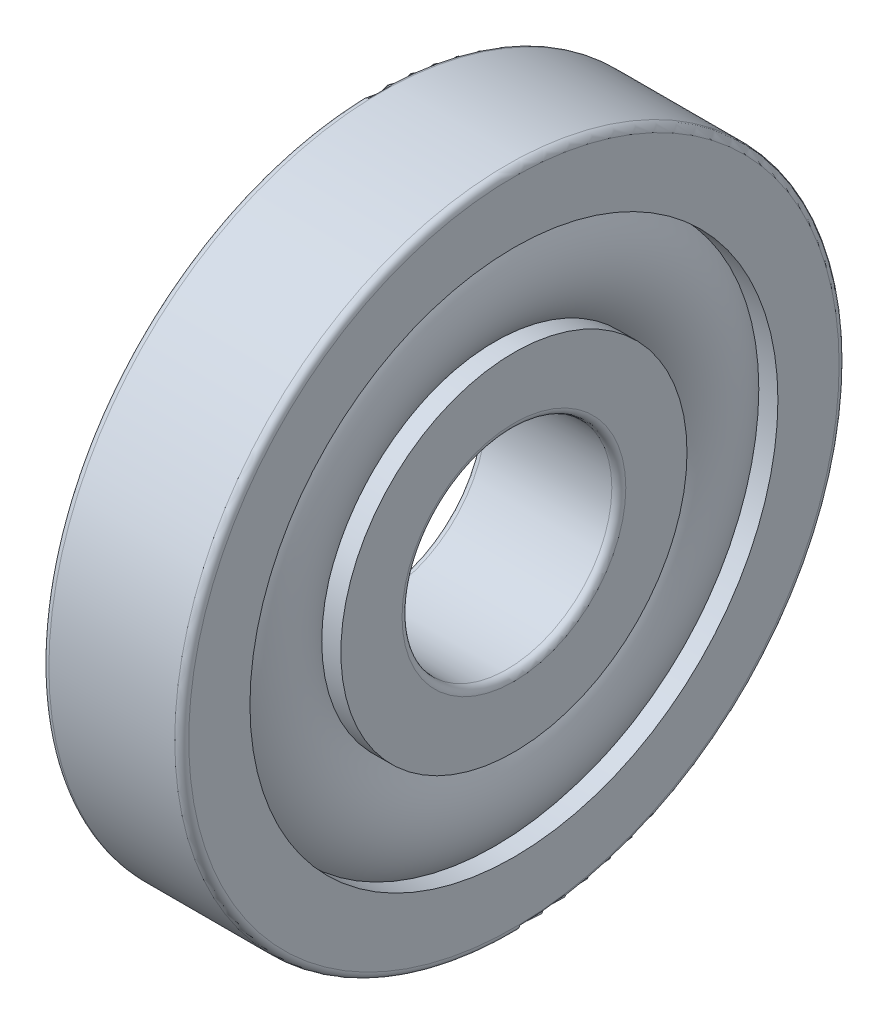
ISO-10303-21;
HEADER;
FILE_DESCRIPTION(('STEP AP214'),'2;1');
FILE_NAME('part.step','',(''),(''),'','','');
FILE_SCHEMA(('AUTOMOTIVE_DESIGN { 1 0 10303 214 1 1 1 1 }'));
ENDSEC;
DATA;
#1=APPLICATION_CONTEXT('core data for automotive mechanical design processes');
#2=APPLICATION_PROTOCOL_DEFINITION('international standard','automotive_design',2000,#1);
#3=PRODUCT_CONTEXT('',#1,'mechanical');
#4=PRODUCT('Part','Part','',(#3));
#5=PRODUCT_RELATED_PRODUCT_CATEGORY('part','',(#4));
#6=PRODUCT_DEFINITION_FORMATION('','',#4);
#7=PRODUCT_DEFINITION_CONTEXT('part definition',#1,'design');
#8=PRODUCT_DEFINITION('design','',#6,#7);
#9=PRODUCT_DEFINITION_SHAPE('','',#8);
#10=(LENGTH_UNIT() NAMED_UNIT(*) SI_UNIT(.MILLI.,.METRE.));
#11=(NAMED_UNIT(*) PLANE_ANGLE_UNIT() SI_UNIT($,.RADIAN.));
#12=(NAMED_UNIT(*) SI_UNIT($,.STERADIAN.) SOLID_ANGLE_UNIT());
#13=UNCERTAINTY_MEASURE_WITH_UNIT(LENGTH_MEASURE(1.E-05),#10,'distance_accuracy_value','');
#14=(GEOMETRIC_REPRESENTATION_CONTEXT(3) GLOBAL_UNCERTAINTY_ASSIGNED_CONTEXT((#13)) GLOBAL_UNIT_ASSIGNED_CONTEXT((#10,
#11,#12)) REPRESENTATION_CONTEXT('',''));
#15=CARTESIAN_POINT('',(0.,0.,0.));
#16=DIRECTION('',(0.,0.,1.));
#17=DIRECTION('',(1.,0.,0.));
#18=AXIS2_PLACEMENT_3D('',#15,#16,#17);
#19=CARTESIAN_POINT('',(0.,0.,0.));
#20=DIRECTION('',(-1.,0.,0.));
#21=DIRECTION('',(0.,0.,1.));
#22=AXIS2_PLACEMENT_3D('',#19,#20,#21);
#23=TOROIDAL_SURFACE('',#22,6.25,1.95);
#24=CARTESIAN_POINT('',(1.45344418537486,0.,0.));
#25=DIRECTION('',(-1.,0.,0.));
#26=DIRECTION('',(0.,0.,1.));
#27=AXIS2_PLACEMENT_3D('',#24,#25,#26);
#28=CIRCLE('',#27,7.55);
#29=CARTESIAN_POINT('',(1.45344418537486,0.,7.55));
#30=VERTEX_POINT('',#29);
#31=EDGE_CURVE('E36',#30,#30,#28,.F.);
#32=ORIENTED_EDGE('',*,*,#31,.T.);
#33=EDGE_LOOP('',(#32));
#34=FACE_BOUND('',#33,.T.);
#35=CARTESIAN_POINT('',(1.45344418537486,0.,0.));
#36=DIRECTION('',(-1.,0.,0.));
#37=DIRECTION('',(0.,0.,1.));
#38=AXIS2_PLACEMENT_3D('',#35,#36,#37);
#39=CIRCLE('',#38,4.95);
#40=CARTESIAN_POINT('',(1.45344418537486,0.,4.95));
#41=VERTEX_POINT('',#40);
#42=EDGE_CURVE('E10',#41,#41,#39,.T.);
#43=ORIENTED_EDGE('',*,*,#42,.T.);
#44=EDGE_LOOP('',(#43));
#45=FACE_BOUND('',#44,.T.);
#46=ADVANCED_FACE('F32',(#34,#45),#23,.T.);
#47=CARTESIAN_POINT('',(-20.6375,0.,0.));
#48=DIRECTION('',(1.,0.,0.));
#49=DIRECTION('',(0.,0.,-1.));
#50=AXIS2_PLACEMENT_3D('',#47,#48,#49);
#51=CYLINDRICAL_SURFACE('',#50,4.95);
#52=CARTESIAN_POINT('',(2.,0.,0.));
#53=DIRECTION('',(1.,0.,0.));
#54=DIRECTION('',(0.,0.,-1.));
#55=AXIS2_PLACEMENT_3D('',#52,#53,#54);
#56=CIRCLE('',#55,4.95);
#57=CARTESIAN_POINT('',(2.,0.,-4.95));
#58=VERTEX_POINT('',#57);
#59=EDGE_CURVE('E45',#58,#58,#56,.T.);
#60=ORIENTED_EDGE('',*,*,#59,.F.);
#61=EDGE_LOOP('',(#60));
#62=FACE_BOUND('',#61,.T.);
#63=ORIENTED_EDGE('',*,*,#42,.F.);
#64=EDGE_LOOP('',(#63));
#65=FACE_BOUND('',#64,.T.);
#66=ADVANCED_FACE('F84',(#62,#65),#51,.T.);
#67=CARTESIAN_POINT('',(-20.6375,0.,0.));
#68=DIRECTION('',(1.,0.,0.));
#69=DIRECTION('',(0.,0.,-1.));
#70=AXIS2_PLACEMENT_3D('',#67,#68,#69);
#71=CYLINDRICAL_SURFACE('',#70,4.95);
#72=CARTESIAN_POINT('',(-2.,0.,0.));
#73=DIRECTION('',(1.,0.,0.));
#74=DIRECTION('',(0.,0.,-1.));
#75=AXIS2_PLACEMENT_3D('',#72,#73,#74);
#76=CIRCLE('',#75,4.95);
#77=CARTESIAN_POINT('',(-2.,0.,-4.95));
#78=VERTEX_POINT('',#77);
#79=EDGE_CURVE('E54',#78,#78,#76,.T.);
#80=ORIENTED_EDGE('',*,*,#79,.T.);
#81=EDGE_LOOP('',(#80));
#82=FACE_BOUND('',#81,.T.);
#83=CARTESIAN_POINT('',(-1.45344418537486,0.,0.));
#84=DIRECTION('',(1.,0.,0.));
#85=DIRECTION('',(0.,0.,-1.));
#86=AXIS2_PLACEMENT_3D('',#83,#84,#85);
#87=CIRCLE('',#86,4.95);
#88=CARTESIAN_POINT('',(-1.45344418537486,0.,-4.95));
#89=VERTEX_POINT('',#88);
#90=EDGE_CURVE('E40',#89,#89,#87,.T.);
#91=ORIENTED_EDGE('',*,*,#90,.F.);
#92=EDGE_LOOP('',(#91));
#93=FACE_BOUND('',#92,.T.);
#94=ADVANCED_FACE('F87',(#82,#93),#71,.T.);
#95=CARTESIAN_POINT('',(2.,3.2,0.));
#96=DIRECTION('',(1.,0.,0.));
#97=DIRECTION('',(0.,0.,-1.));
#98=AXIS2_PLACEMENT_3D('',#95,#96,#97);
#99=PLANE('',#98);
#100=ORIENTED_EDGE('',*,*,#59,.T.);
#101=EDGE_LOOP('',(#100));
#102=FACE_BOUND('',#101,.T.);
#103=CARTESIAN_POINT('',(2.,0.,0.));
#104=DIRECTION('',(1.,0.,0.));
#105=DIRECTION('',(0.,0.,-1.));
#106=AXIS2_PLACEMENT_3D('',#103,#104,#105);
#107=CIRCLE('',#106,3.2);
#108=CARTESIAN_POINT('',(2.,0.,-3.2));
#109=VERTEX_POINT('',#108);
#110=EDGE_CURVE('E76',#109,#109,#107,.T.);
#111=ORIENTED_EDGE('',*,*,#110,.F.);
#112=EDGE_LOOP('',(#111));
#113=FACE_BOUND('',#112,.T.);
#114=ADVANCED_FACE('F81',(#102,#113),#99,.T.);
#115=CARTESIAN_POINT('',(1.8,0.,0.));
#116=DIRECTION('',(1.,0.,0.));
#117=DIRECTION('',(0.,0.,-1.));
#118=AXIS2_PLACEMENT_3D('',#115,#116,#117);
#119=TOROIDAL_SURFACE('',#118,3.2,0.2);
#120=ORIENTED_EDGE('',*,*,#110,.T.);
#121=EDGE_LOOP('',(#120));
#122=FACE_BOUND('',#121,.T.);
#123=CARTESIAN_POINT('',(1.8,0.,0.));
#124=DIRECTION('',(1.,0.,0.));
#125=DIRECTION('',(0.,0.,-1.));
#126=AXIS2_PLACEMENT_3D('',#123,#124,#125);
#127=CIRCLE('',#126,3.);
#128=CARTESIAN_POINT('',(1.8,0.,-3.));
#129=VERTEX_POINT('',#128);
#130=EDGE_CURVE('E73',#129,#129,#127,.T.);
#131=ORIENTED_EDGE('',*,*,#130,.F.);
#132=EDGE_LOOP('',(#131));
#133=FACE_BOUND('',#132,.T.);
#134=ADVANCED_FACE('F98',(#122,#133),#119,.T.);
#135=CARTESIAN_POINT('',(-20.6375,0.,0.));
#136=DIRECTION('',(1.,0.,0.));
#137=DIRECTION('',(0.,0.,-1.));
#138=AXIS2_PLACEMENT_3D('',#135,#136,#137);
#139=CYLINDRICAL_SURFACE('',#138,3.);
#140=ORIENTED_EDGE('',*,*,#130,.T.);
#141=EDGE_LOOP('',(#140));
#142=FACE_BOUND('',#141,.T.);
#143=CARTESIAN_POINT('',(-1.8,0.,0.));
#144=DIRECTION('',(1.,0.,0.));
#145=DIRECTION('',(0.,0.,-1.));
#146=AXIS2_PLACEMENT_3D('',#143,#144,#145);
#147=CIRCLE('',#146,3.);
#148=CARTESIAN_POINT('',(-1.8,0.,-3.));
#149=VERTEX_POINT('',#148);
#150=EDGE_CURVE('E70',#149,#149,#147,.T.);
#151=ORIENTED_EDGE('',*,*,#150,.F.);
#152=EDGE_LOOP('',(#151));
#153=FACE_BOUND('',#152,.T.);
#154=ADVANCED_FACE('F101',(#142,#153),#139,.F.);
#155=CARTESIAN_POINT('',(-1.8,0.,0.));
#156=DIRECTION('',(1.,0.,0.));
#157=DIRECTION('',(0.,0.,-1.));
#158=AXIS2_PLACEMENT_3D('',#155,#156,#157);
#159=TOROIDAL_SURFACE('',#158,3.2,0.2);
#160=ORIENTED_EDGE('',*,*,#150,.T.);
#161=EDGE_LOOP('',(#160));
#162=FACE_BOUND('',#161,.T.);
#163=CARTESIAN_POINT('',(-2.,0.,0.));
#164=DIRECTION('',(1.,0.,0.));
#165=DIRECTION('',(0.,0.,-1.));
#166=AXIS2_PLACEMENT_3D('',#163,#164,#165);
#167=CIRCLE('',#166,3.2);
#168=CARTESIAN_POINT('',(-2.,0.,-3.2));
#169=VERTEX_POINT('',#168);
#170=EDGE_CURVE('E67',#169,#169,#167,.T.);
#171=ORIENTED_EDGE('',*,*,#170,.F.);
#172=EDGE_LOOP('',(#171));
#173=FACE_BOUND('',#172,.T.);
#174=ADVANCED_FACE('F105',(#162,#173),#159,.T.);
#175=CARTESIAN_POINT('',(-2.,4.95,0.));
#176=DIRECTION('',(-1.,0.,0.));
#177=DIRECTION('',(0.,0.,1.));
#178=AXIS2_PLACEMENT_3D('',#175,#176,#177);
#179=PLANE('',#178);
#180=ORIENTED_EDGE('',*,*,#170,.T.);
#181=EDGE_LOOP('',(#180));
#182=FACE_BOUND('',#181,.T.);
#183=ORIENTED_EDGE('',*,*,#79,.F.);
#184=EDGE_LOOP('',(#183));
#185=FACE_BOUND('',#184,.T.);
#186=ADVANCED_FACE('F109',(#182,#185),#179,.T.);
#187=CARTESIAN_POINT('',(-1.45344418537486,0.,0.));
#188=DIRECTION('',(1.,0.,0.));
#189=DIRECTION('',(0.,0.,-1.));
#190=AXIS2_PLACEMENT_3D('',#187,#188,#189);
#191=CIRCLE('',#190,7.55);
#192=CARTESIAN_POINT('',(-1.45344418537486,0.,-7.55));
#193=VERTEX_POINT('',#192);
#194=EDGE_CURVE('E48',#193,#193,#191,.F.);
#195=ORIENTED_EDGE('',*,*,#194,.T.);
#196=EDGE_LOOP('',(#195));
#197=FACE_BOUND('',#196,.T.);
#198=ORIENTED_EDGE('',*,*,#90,.T.);
#199=EDGE_LOOP('',(#198));
#200=FACE_BOUND('',#199,.T.);
#201=ADVANCED_FACE('F34',(#197,#200),#23,.T.);
#202=CARTESIAN_POINT('',(-20.6375,0.,0.));
#203=DIRECTION('',(1.,0.,0.));
#204=DIRECTION('',(0.,0.,-1.));
#205=AXIS2_PLACEMENT_3D('',#202,#203,#204);
#206=CYLINDRICAL_SURFACE('',#205,7.55);
#207=CARTESIAN_POINT('',(2.,0.,0.));
#208=DIRECTION('',(1.,0.,0.));
#209=DIRECTION('',(0.,0.,-1.));
#210=AXIS2_PLACEMENT_3D('',#207,#208,#209);
#211=CIRCLE('',#210,7.55);
#212=CARTESIAN_POINT('',(2.,0.,-7.55));
#213=VERTEX_POINT('',#212);
#214=EDGE_CURVE('E50',#213,#213,#211,.T.);
#215=ORIENTED_EDGE('',*,*,#214,.T.);
#216=EDGE_LOOP('',(#215));
#217=FACE_BOUND('',#216,.T.);
#218=ORIENTED_EDGE('',*,*,#31,.F.);
#219=EDGE_LOOP('',(#218));
#220=FACE_BOUND('',#219,.T.);
#221=ADVANCED_FACE('F114',(#217,#220),#206,.F.);
#222=CARTESIAN_POINT('',(-20.6375,0.,0.));
#223=DIRECTION('',(1.,0.,0.));
#224=DIRECTION('',(0.,0.,-1.));
#225=AXIS2_PLACEMENT_3D('',#222,#223,#224);
#226=CYLINDRICAL_SURFACE('',#225,7.55);
#227=CARTESIAN_POINT('',(-2.,0.,0.));
#228=DIRECTION('',(1.,0.,0.));
#229=DIRECTION('',(0.,0.,-1.));
#230=AXIS2_PLACEMENT_3D('',#227,#228,#229);
#231=CIRCLE('',#230,7.55);
#232=CARTESIAN_POINT('',(-2.,0.,-7.55));
#233=VERTEX_POINT('',#232);
#234=EDGE_CURVE('E145',#233,#233,#231,.T.);
#235=ORIENTED_EDGE('',*,*,#234,.F.);
#236=EDGE_LOOP('',(#235));
#237=FACE_BOUND('',#236,.T.);
#238=ORIENTED_EDGE('',*,*,#194,.F.);
#239=EDGE_LOOP('',(#238));
#240=FACE_BOUND('',#239,.T.);
#241=ADVANCED_FACE('F117',(#237,#240),#226,.F.);
#242=CARTESIAN_POINT('',(2.,9.3,0.));
#243=DIRECTION('',(1.,0.,0.));
#244=DIRECTION('',(0.,0.,-1.));
#245=AXIS2_PLACEMENT_3D('',#242,#243,#244);
#246=PLANE('',#245);
#247=CARTESIAN_POINT('',(2.,0.,0.));
#248=DIRECTION('',(1.,0.,0.));
#249=DIRECTION('',(0.,0.,-1.));
#250=AXIS2_PLACEMENT_3D('',#247,#248,#249);
#251=CIRCLE('',#250,9.3);
#252=CARTESIAN_POINT('',(2.,0.,-9.3));
#253=VERTEX_POINT('',#252);
#254=EDGE_CURVE('E56',#253,#253,#251,.T.);
#255=ORIENTED_EDGE('',*,*,#254,.T.);
#256=EDGE_LOOP('',(#255));
#257=FACE_BOUND('',#256,.T.);
#258=ORIENTED_EDGE('',*,*,#214,.F.);
#259=EDGE_LOOP('',(#258));
#260=FACE_BOUND('',#259,.T.);
#261=ADVANCED_FACE('F118',(#257,#260),#246,.T.);
#262=CARTESIAN_POINT('',(1.8,0.,0.));
#263=DIRECTION('',(1.,0.,0.));
#264=DIRECTION('',(0.,0.,-1.));
#265=AXIS2_PLACEMENT_3D('',#262,#263,#264);
#266=TOROIDAL_SURFACE('',#265,9.3,0.2);
#267=CARTESIAN_POINT('',(1.8,0.,0.));
#268=DIRECTION('',(1.,0.,0.));
#269=DIRECTION('',(0.,0.,-1.));
#270=AXIS2_PLACEMENT_3D('',#267,#268,#269);
#271=CIRCLE('',#270,9.50000000000001);
#272=CARTESIAN_POINT('',(1.8,0.,-9.50000000000001));
#273=VERTEX_POINT('',#272);
#274=EDGE_CURVE('E61',#273,#273,#271,.T.);
#275=ORIENTED_EDGE('',*,*,#274,.T.);
#276=EDGE_LOOP('',(#275));
#277=FACE_BOUND('',#276,.T.);
#278=ORIENTED_EDGE('',*,*,#254,.F.);
#279=EDGE_LOOP('',(#278));
#280=FACE_BOUND('',#279,.T.);
#281=ADVANCED_FACE('F121',(#277,#280),#266,.T.);
#282=CARTESIAN_POINT('',(-20.6375,0.,0.));
#283=DIRECTION('',(1.,0.,0.));
#284=DIRECTION('',(0.,0.,-1.));
#285=AXIS2_PLACEMENT_3D('',#282,#283,#284);
#286=CYLINDRICAL_SURFACE('',#285,9.50000000000001);
#287=CARTESIAN_POINT('',(-1.8,0.,0.));
#288=DIRECTION('',(1.,0.,0.));
#289=DIRECTION('',(0.,0.,-1.));
#290=AXIS2_PLACEMENT_3D('',#287,#288,#289);
#291=CIRCLE('',#290,9.50000000000001);
#292=CARTESIAN_POINT('',(-1.8,0.,-9.50000000000001));
#293=VERTEX_POINT('',#292);
#294=EDGE_CURVE('E149',#293,#293,#291,.T.);
#295=ORIENTED_EDGE('',*,*,#294,.T.);
#296=EDGE_LOOP('',(#295));
#297=FACE_BOUND('',#296,.T.);
#298=ORIENTED_EDGE('',*,*,#274,.F.);
#299=EDGE_LOOP('',(#298));
#300=FACE_BOUND('',#299,.T.);
#301=ADVANCED_FACE('F125',(#297,#300),#286,.T.);
#302=CARTESIAN_POINT('',(-1.8,0.,0.));
#303=DIRECTION('',(1.,0.,0.));
#304=DIRECTION('',(0.,0.,-1.));
#305=AXIS2_PLACEMENT_3D('',#302,#303,#304);
#306=TOROIDAL_SURFACE('',#305,9.3,0.2);
#307=CARTESIAN_POINT('',(-2.,0.,0.));
#308=DIRECTION('',(1.,0.,0.));
#309=DIRECTION('',(0.,0.,-1.));
#310=AXIS2_PLACEMENT_3D('',#307,#308,#309);
#311=CIRCLE('',#310,9.3);
#312=CARTESIAN_POINT('',(-2.,0.,-9.3));
#313=VERTEX_POINT('',#312);
#314=EDGE_CURVE('E146',#313,#313,#311,.T.);
#315=ORIENTED_EDGE('',*,*,#314,.T.);
#316=EDGE_LOOP('',(#315));
#317=FACE_BOUND('',#316,.T.);
#318=ORIENTED_EDGE('',*,*,#294,.F.);
#319=EDGE_LOOP('',(#318));
#320=FACE_BOUND('',#319,.T.);
#321=ADVANCED_FACE('F129',(#317,#320),#306,.T.);
#322=CARTESIAN_POINT('',(-2.,7.55,0.));
#323=DIRECTION('',(-1.,0.,0.));
#324=DIRECTION('',(0.,0.,1.));
#325=AXIS2_PLACEMENT_3D('',#322,#323,#324);
#326=PLANE('',#325);
#327=ORIENTED_EDGE('',*,*,#234,.T.);
#328=EDGE_LOOP('',(#327));
#329=FACE_BOUND('',#328,.T.);
#330=ORIENTED_EDGE('',*,*,#314,.F.);
#331=EDGE_LOOP('',(#330));
#332=FACE_BOUND('',#331,.T.);
#333=ADVANCED_FACE('F133',(#329,#332),#326,.T.);
#334=CLOSED_SHELL('',(#46,#66,#94,#114,#134,#154,#174,#186,#201,#221,#241,#261,#281,#301,#321,#333));
#335=MANIFOLD_SOLID_BREP('B2',#334);
#336=ADVANCED_BREP_SHAPE_REPRESENTATION('',(#18,#335),#14);
#337=SHAPE_DEFINITION_REPRESENTATION(#9,#336);
ENDSEC;
END-ISO-10303-21;
